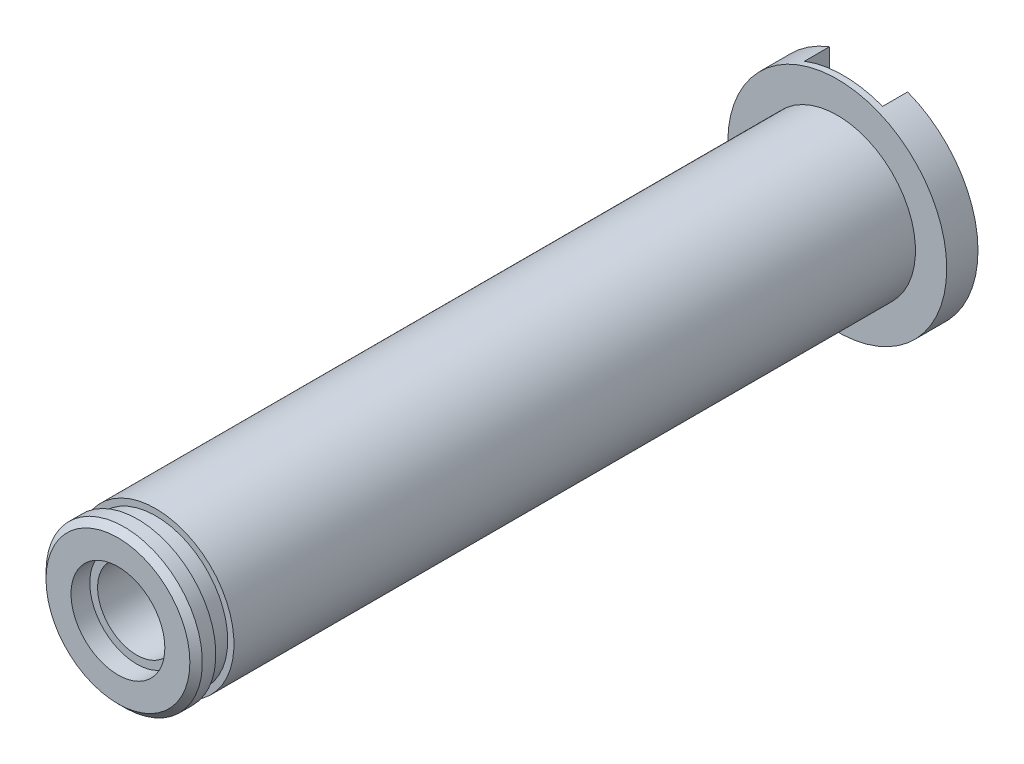
ISO-10303-21;
HEADER;
FILE_DESCRIPTION(('STEP AP214'),'2;1');
FILE_NAME('part.step','',(''),(''),'','','');
FILE_SCHEMA(('AUTOMOTIVE_DESIGN { 1 0 10303 214 1 1 1 1 }'));
ENDSEC;
DATA;
#1=APPLICATION_CONTEXT('core data for automotive mechanical design processes');
#2=APPLICATION_PROTOCOL_DEFINITION('international standard','automotive_design',2000,#1);
#3=PRODUCT_CONTEXT('',#1,'mechanical');
#4=PRODUCT('Part','Part','',(#3));
#5=PRODUCT_RELATED_PRODUCT_CATEGORY('part','',(#4));
#6=PRODUCT_DEFINITION_FORMATION('','',#4);
#7=PRODUCT_DEFINITION_CONTEXT('part definition',#1,'design');
#8=PRODUCT_DEFINITION('design','',#6,#7);
#9=PRODUCT_DEFINITION_SHAPE('','',#8);
#10=(LENGTH_UNIT() NAMED_UNIT(*) SI_UNIT(.MILLI.,.METRE.));
#11=(NAMED_UNIT(*) PLANE_ANGLE_UNIT() SI_UNIT($,.RADIAN.));
#12=(NAMED_UNIT(*) SI_UNIT($,.STERADIAN.) SOLID_ANGLE_UNIT());
#13=UNCERTAINTY_MEASURE_WITH_UNIT(LENGTH_MEASURE(1.E-05),#10,'distance_accuracy_value','');
#14=(GEOMETRIC_REPRESENTATION_CONTEXT(3) GLOBAL_UNCERTAINTY_ASSIGNED_CONTEXT((#13)) GLOBAL_UNIT_ASSIGNED_CONTEXT((#10,
#11,#12)) REPRESENTATION_CONTEXT('',''));
#15=CARTESIAN_POINT('',(0.,0.,0.));
#16=DIRECTION('',(0.,0.,1.));
#17=DIRECTION('',(1.,0.,0.));
#18=AXIS2_PLACEMENT_3D('',#15,#16,#17);
#19=CARTESIAN_POINT('',(0.,0.,30.48));
#20=DIRECTION('',(0.,0.,-1.));
#21=DIRECTION('',(-1.,0.,0.));
#22=AXIS2_PLACEMENT_3D('',#19,#20,#21);
#23=CYLINDRICAL_SURFACE('',#22,3.175);
#24=CARTESIAN_POINT('',(0.,0.,1.27));
#25=DIRECTION('',(0.,0.,1.));
#26=DIRECTION('',(1.,0.,0.));
#27=AXIS2_PLACEMENT_3D('',#24,#25,#26);
#28=CIRCLE('',#27,3.175);
#29=CARTESIAN_POINT('',(-3.175,0.,1.27));
#30=VERTEX_POINT('',#29);
#31=EDGE_CURVE('E138',#30,#30,#28,.T.);
#32=CARTESIAN_POINT('',(0.,0.,28.9433));
#33=DIRECTION('',(0.,0.,1.));
#34=DIRECTION('',(1.,0.,0.));
#35=AXIS2_PLACEMENT_3D('',#32,#33,#34);
#36=CIRCLE('',#35,3.175);
#37=CARTESIAN_POINT('',(-3.175,0.,28.9433));
#38=VERTEX_POINT('',#37);
#39=EDGE_CURVE('E202',#38,#38,#36,.T.);
#40=CARTESIAN_POINT('',(-3.175,0.,1.27));
#41=CARTESIAN_POINT('',(-3.175,0.,1.55826354166667));
#42=CARTESIAN_POINT('',(-3.175,0.,1.84652708333333));
#43=CARTESIAN_POINT('',(-3.175,0.,2.42305416666667));
#44=CARTESIAN_POINT('',(-3.175,0.,2.71131770833333));
#45=CARTESIAN_POINT('',(-3.175,0.,3.28784479166667));
#46=CARTESIAN_POINT('',(-3.175,0.,3.57610833333333));
#47=CARTESIAN_POINT('',(-3.175,0.,4.15263541666667));
#48=CARTESIAN_POINT('',(-3.175,0.,4.44089895833334));
#49=CARTESIAN_POINT('',(-3.175,0.,5.01742604166667));
#50=CARTESIAN_POINT('',(-3.175,0.,5.30568958333334));
#51=CARTESIAN_POINT('',(-3.175,0.,5.88221666666667));
#52=CARTESIAN_POINT('',(-3.175,0.,6.17048020833333));
#53=CARTESIAN_POINT('',(-3.175,0.,6.74700729166667));
#54=CARTESIAN_POINT('',(-3.175,0.,7.03527083333333));
#55=CARTESIAN_POINT('',(-3.175,0.,7.61179791666667));
#56=CARTESIAN_POINT('',(-3.175,0.,7.90006145833333));
#57=CARTESIAN_POINT('',(-3.175,0.,8.47658854166667));
#58=CARTESIAN_POINT('',(-3.175,0.,8.76485208333333));
#59=CARTESIAN_POINT('',(-3.175,0.,9.34137916666667));
#60=CARTESIAN_POINT('',(-3.175,0.,9.62964270833333));
#61=CARTESIAN_POINT('',(-3.175,0.,10.2061697916667));
#62=CARTESIAN_POINT('',(-3.175,0.,10.4944333333333));
#63=CARTESIAN_POINT('',(-3.175,0.,11.0709604166667));
#64=CARTESIAN_POINT('',(-3.175,0.,11.3592239583333));
#65=CARTESIAN_POINT('',(-3.175,0.,11.9357510416667));
#66=CARTESIAN_POINT('',(-3.175,0.,12.2240145833333));
#67=CARTESIAN_POINT('',(-3.175,0.,12.8005416666667));
#68=CARTESIAN_POINT('',(-3.175,0.,13.0888052083333));
#69=CARTESIAN_POINT('',(-3.175,0.,13.6653322916667));
#70=CARTESIAN_POINT('',(-3.175,0.,13.9535958333333));
#71=CARTESIAN_POINT('',(-3.175,0.,14.5301229166667));
#72=CARTESIAN_POINT('',(-3.175,0.,14.8183864583333));
#73=CARTESIAN_POINT('',(-3.175,0.,15.3949135416667));
#74=CARTESIAN_POINT('',(-3.175,0.,15.6831770833333));
#75=CARTESIAN_POINT('',(-3.175,0.,16.2597041666667));
#76=CARTESIAN_POINT('',(-3.175,0.,16.5479677083333));
#77=CARTESIAN_POINT('',(-3.175,0.,17.1244947916667));
#78=CARTESIAN_POINT('',(-3.175,0.,17.4127583333333));
#79=CARTESIAN_POINT('',(-3.175,0.,17.9892854166667));
#80=CARTESIAN_POINT('',(-3.175,0.,18.2775489583333));
#81=CARTESIAN_POINT('',(-3.175,0.,18.8540760416667));
#82=CARTESIAN_POINT('',(-3.175,0.,19.1423395833333));
#83=CARTESIAN_POINT('',(-3.175,0.,19.7188666666667));
#84=CARTESIAN_POINT('',(-3.175,0.,20.0071302083333));
#85=CARTESIAN_POINT('',(-3.175,0.,20.5836572916667));
#86=CARTESIAN_POINT('',(-3.175,0.,20.8719208333333));
#87=CARTESIAN_POINT('',(-3.175,0.,21.4484479166667));
#88=CARTESIAN_POINT('',(-3.175,0.,21.7367114583333));
#89=CARTESIAN_POINT('',(-3.175,0.,22.3132385416667));
#90=CARTESIAN_POINT('',(-3.175,0.,22.6015020833333));
#91=CARTESIAN_POINT('',(-3.175,0.,23.1780291666667));
#92=CARTESIAN_POINT('',(-3.175,0.,23.4662927083333));
#93=CARTESIAN_POINT('',(-3.175,0.,24.0428197916667));
#94=CARTESIAN_POINT('',(-3.175,0.,24.3310833333333));
#95=CARTESIAN_POINT('',(-3.175,0.,24.9076104166667));
#96=CARTESIAN_POINT('',(-3.175,0.,25.1958739583333));
#97=CARTESIAN_POINT('',(-3.175,0.,25.7724010416667));
#98=CARTESIAN_POINT('',(-3.175,0.,26.0606645833333));
#99=CARTESIAN_POINT('',(-3.175,0.,26.6371916666667));
#100=CARTESIAN_POINT('',(-3.175,0.,26.9254552083333));
#101=CARTESIAN_POINT('',(-3.175,0.,27.5019822916667));
#102=CARTESIAN_POINT('',(-3.175,0.,27.7902458333333));
#103=CARTESIAN_POINT('',(-3.175,0.,28.3667729166667));
#104=CARTESIAN_POINT('',(-3.175,0.,28.6550364583333));
#105=CARTESIAN_POINT('',(-3.175,0.,28.9433));
#106=B_SPLINE_CURVE_WITH_KNOTS('',3,(#40,#41,#42,#43,#44,#45,#46,#47,#48,#49,#50,#51,#52,#53,
#54,#55,#56,#57,#58,#59,#60,#61,#62,#63,#64,#65,#66,#67,#68,#69,#70,#71,#72,#73,#74,#75,#76,#77,
#78,#79,#80,#81,#82,#83,#84,#85,#86,#87,#88,#89,#90,#91,#92,#93,#94,#95,#96,#97,#98,#99,#100,
#101,#102,#103,#104,#105),.UNSPECIFIED.,.F.,.F.,(4,2,2,2,2,2,2,2,2,2,2,2,2,2,2,2,2,2,2,2,2,2,2,
2,2,2,2,2,2,2,2,2,4),(0.,0.864790625,1.72958125,2.594371875,3.4591625,4.323953125,5.18874375,
6.053534375,6.918325,7.783115625,8.64790625,9.512696875,10.3774875,11.242278125,12.10706875,
12.971859375,13.83665,14.701440625,15.56623125,16.431021875,17.2958125,18.160603125,19.02539375,
19.890184375,20.754975,21.619765625,22.48455625,23.349346875,24.2141375,25.078928125,
25.94371875,26.808509375,27.6733),.UNSPECIFIED.);
#107=EDGE_CURVE('BSEAM51',#30,#38,#106,.T.);
#108=ORIENTED_EDGE('',*,*,#31,.T.);
#109=ORIENTED_EDGE('',*,*,#39,.F.);
#110=ORIENTED_EDGE('',*,*,#107,.T.);
#111=ORIENTED_EDGE('',*,*,#107,.F.);
#112=EDGE_LOOP('',(#108,#110,#109,#111));
#113=FACE_BOUND('',#112,.T.);
#114=ADVANCED_FACE('F51',(#113),#23,.T.);
#115=CARTESIAN_POINT('',(0.,0.,-7.11199999999998));
#116=DIRECTION('',(0.,0.,1.));
#117=DIRECTION('',(1.,0.,0.));
#118=AXIS2_PLACEMENT_3D('',#115,#116,#117);
#119=CYLINDRICAL_SURFACE('',#118,1.5875);
#120=CARTESIAN_POINT('',(0.,0.,1.016));
#121=DIRECTION('',(0.,0.,-1.));
#122=DIRECTION('',(-1.,0.,0.));
#123=AXIS2_PLACEMENT_3D('',#120,#121,#122);
#124=CIRCLE('',#123,1.5875);
#125=CARTESIAN_POINT('',(1.5875,0.,1.016));
#126=VERTEX_POINT('',#125);
#127=CARTESIAN_POINT('',(-1.5875,0.,1.016));
#128=VERTEX_POINT('',#127);
#129=EDGE_CURVE('E97',#126,#128,#124,.F.);
#130=ORIENTED_EDGE('',*,*,#129,.F.);
#131=DIRECTION('',(0.,0.,-1.));
#132=VECTOR('',#131,1.);
#133=CARTESIAN_POINT('',(1.5875,0.,1.016));
#134=LINE('',#133,#132);
#135=CARTESIAN_POINT('',(1.5875,0.,0.));
#136=VERTEX_POINT('',#135);
#137=EDGE_CURVE('E105',#126,#136,#134,.T.);
#138=ORIENTED_EDGE('',*,*,#137,.T.);
#139=CARTESIAN_POINT('',(0.,0.,0.));
#140=DIRECTION('',(0.,0.,1.));
#141=DIRECTION('',(1.,0.,0.));
#142=AXIS2_PLACEMENT_3D('',#139,#140,#141);
#143=CIRCLE('',#142,1.5875);
#144=CARTESIAN_POINT('',(-1.5875,0.,0.));
#145=VERTEX_POINT('',#144);
#146=EDGE_CURVE('E134',#145,#136,#143,.T.);
#147=ORIENTED_EDGE('',*,*,#146,.F.);
#148=DIRECTION('',(0.,0.,-1.));
#149=VECTOR('',#148,1.);
#150=CARTESIAN_POINT('',(-1.5875,0.,1.016));
#151=LINE('',#150,#149);
#152=EDGE_CURVE('E68',#128,#145,#151,.T.);
#153=ORIENTED_EDGE('',*,*,#152,.F.);
#154=EDGE_LOOP('',(#130,#138,#147,#153));
#155=FACE_BOUND('',#154,.T.);
#156=CARTESIAN_POINT('',(0.,0.,29.718));
#157=DIRECTION('',(0.,0.,1.));
#158=DIRECTION('',(1.,0.,0.));
#159=AXIS2_PLACEMENT_3D('',#156,#157,#158);
#160=CIRCLE('',#159,1.5875);
#161=CARTESIAN_POINT('',(1.5875,0.,29.718));
#162=VERTEX_POINT('',#161);
#163=EDGE_CURVE('E132',#162,#162,#160,.F.);
#164=ORIENTED_EDGE('',*,*,#163,.F.);
#165=EDGE_LOOP('',(#164));
#166=FACE_BOUND('',#165,.T.);
#167=ADVANCED_FACE('F114',(#155,#166),#119,.F.);
#168=CARTESIAN_POINT('',(0.,0.,1.27));
#169=DIRECTION('',(0.,0.,-1.));
#170=DIRECTION('',(-1.,0.,0.));
#171=AXIS2_PLACEMENT_3D('',#168,#169,#170);
#172=CYLINDRICAL_SURFACE('',#171,4.445);
#173=CARTESIAN_POINT('',(0.,0.,0.));
#174=DIRECTION('',(0.,0.,1.));
#175=DIRECTION('',(1.,0.,0.));
#176=AXIS2_PLACEMENT_3D('',#173,#174,#175);
#177=CIRCLE('',#176,4.445);
#178=CARTESIAN_POINT('',(-1.5875,4.15185124372249,0.));
#179=VERTEX_POINT('',#178);
#180=CARTESIAN_POINT('',(1.5875,4.15185124372249,0.));
#181=VERTEX_POINT('',#180);
#182=EDGE_CURVE('E137',#179,#181,#177,.T.);
#183=ORIENTED_EDGE('',*,*,#182,.T.);
#184=DIRECTION('',(0.,0.,-1.));
#185=VECTOR('',#184,1.);
#186=CARTESIAN_POINT('',(1.5875,4.15185124372249,1.27));
#187=LINE('',#186,#185);
#188=CARTESIAN_POINT('',(1.5875,4.15185124372249,1.016));
#189=VERTEX_POINT('',#188);
#190=EDGE_CURVE('E118',#181,#189,#187,.F.);
#191=ORIENTED_EDGE('',*,*,#190,.T.);
#192=CARTESIAN_POINT('',(0.,0.,1.016));
#193=DIRECTION('',(0.,0.,-1.));
#194=DIRECTION('',(-1.,0.,0.));
#195=AXIS2_PLACEMENT_3D('',#192,#193,#194);
#196=CIRCLE('',#195,4.445);
#197=CARTESIAN_POINT('',(-1.5875,4.15185124372249,1.016));
#198=VERTEX_POINT('',#197);
#199=EDGE_CURVE('E76',#198,#189,#196,.T.);
#200=ORIENTED_EDGE('',*,*,#199,.F.);
#201=DIRECTION('',(0.,0.,-1.));
#202=VECTOR('',#201,1.);
#203=CARTESIAN_POINT('',(-1.5875,4.15185124372249,1.27));
#204=LINE('',#203,#202);
#205=EDGE_CURVE('E126',#198,#179,#204,.T.);
#206=ORIENTED_EDGE('',*,*,#205,.T.);
#207=EDGE_LOOP('',(#183,#191,#200,#206));
#208=FACE_BOUND('',#207,.T.);
#209=CARTESIAN_POINT('',(0.,0.,1.27));
#210=DIRECTION('',(0.,0.,1.));
#211=DIRECTION('',(1.,0.,0.));
#212=AXIS2_PLACEMENT_3D('',#209,#210,#211);
#213=CIRCLE('',#212,4.445);
#214=CARTESIAN_POINT('',(4.445,0.,1.27));
#215=VERTEX_POINT('',#214);
#216=EDGE_CURVE('E142',#215,#215,#213,.T.);
#217=ORIENTED_EDGE('',*,*,#216,.F.);
#218=EDGE_LOOP('',(#217));
#219=FACE_BOUND('',#218,.T.);
#220=ADVANCED_FACE('F180',(#208,#219),#172,.T.);
#221=CARTESIAN_POINT('',(0.,0.,1.27));
#222=DIRECTION('',(0.,0.,1.));
#223=DIRECTION('',(1.,0.,0.));
#224=AXIS2_PLACEMENT_3D('',#221,#222,#223);
#225=PLANE('',#224);
#226=ORIENTED_EDGE('',*,*,#31,.F.);
#227=EDGE_LOOP('',(#226));
#228=FACE_BOUND('',#227,.T.);
#229=ORIENTED_EDGE('',*,*,#216,.T.);
#230=EDGE_LOOP('',(#229));
#231=FACE_BOUND('',#230,.T.);
#232=ADVANCED_FACE('F193',(#228,#231),#225,.T.);
#233=CARTESIAN_POINT('',(0.,0.,0.));
#234=DIRECTION('',(0.,0.,1.));
#235=DIRECTION('',(1.,0.,0.));
#236=AXIS2_PLACEMENT_3D('',#233,#234,#235);
#237=PLANE('',#236);
#238=ORIENTED_EDGE('',*,*,#146,.T.);
#239=DIRECTION('',(0.,1.,0.));
#240=VECTOR('',#239,1.);
#241=CARTESIAN_POINT('',(1.5875,0.,0.));
#242=LINE('',#241,#240);
#243=EDGE_CURVE('E108',#136,#181,#242,.T.);
#244=ORIENTED_EDGE('',*,*,#243,.T.);
#245=ORIENTED_EDGE('',*,*,#182,.F.);
#246=DIRECTION('',(0.,1.,0.));
#247=VECTOR('',#246,1.);
#248=CARTESIAN_POINT('',(-1.5875,5.87336768810331,0.));
#249=LINE('',#248,#247);
#250=EDGE_CURVE('E102',#145,#179,#249,.T.);
#251=ORIENTED_EDGE('',*,*,#250,.F.);
#252=EDGE_LOOP('',(#238,#244,#245,#251));
#253=FACE_BOUND('',#252,.T.);
#254=ADVANCED_FACE('F186',(#253),#237,.F.);
#255=CARTESIAN_POINT('',(0.,0.,30.226));
#256=DIRECTION('',(0.,0.,1.));
#257=DIRECTION('',(1.,0.,0.));
#258=AXIS2_PLACEMENT_3D('',#255,#256,#257);
#259=CIRCLE('',#258,3.175);
#260=CARTESIAN_POINT('',(-3.175,0.,30.226));
#261=VERTEX_POINT('',#260);
#262=EDGE_CURVE('E13',#261,#261,#259,.F.);
#263=CARTESIAN_POINT('',(0.,0.,29.6799));
#264=DIRECTION('',(0.,0.,1.));
#265=DIRECTION('',(1.,0.,0.));
#266=AXIS2_PLACEMENT_3D('',#263,#264,#265);
#267=CIRCLE('',#266,3.175);
#268=CARTESIAN_POINT('',(-3.175,0.,29.6799));
#269=VERTEX_POINT('',#268);
#270=EDGE_CURVE('E199',#269,#269,#267,.T.);
#271=CARTESIAN_POINT('',(-3.175,0.,30.226));
#272=CARTESIAN_POINT('',(-3.175,0.,30.2203114583333));
#273=CARTESIAN_POINT('',(-3.175,0.,30.2146229166667));
#274=CARTESIAN_POINT('',(-3.175,0.,30.2032458333333));
#275=CARTESIAN_POINT('',(-3.175,0.,30.1975572916667));
#276=CARTESIAN_POINT('',(-3.175,0.,30.1861802083333));
#277=CARTESIAN_POINT('',(-3.175,0.,30.1804916666667));
#278=CARTESIAN_POINT('',(-3.175,0.,30.1691145833333));
#279=CARTESIAN_POINT('',(-3.175,0.,30.1634260416667));
#280=CARTESIAN_POINT('',(-3.175,0.,30.1520489583333));
#281=CARTESIAN_POINT('',(-3.175,0.,30.1463604166667));
#282=CARTESIAN_POINT('',(-3.175,0.,30.1349833333333));
#283=CARTESIAN_POINT('',(-3.175,0.,30.1292947916667));
#284=CARTESIAN_POINT('',(-3.175,0.,30.1179177083333));
#285=CARTESIAN_POINT('',(-3.175,0.,30.1122291666667));
#286=CARTESIAN_POINT('',(-3.175,0.,30.1008520833333));
#287=CARTESIAN_POINT('',(-3.175,0.,30.0951635416667));
#288=CARTESIAN_POINT('',(-3.175,0.,30.0837864583333));
#289=CARTESIAN_POINT('',(-3.175,0.,30.0780979166667));
#290=CARTESIAN_POINT('',(-3.175,0.,30.0667208333333));
#291=CARTESIAN_POINT('',(-3.175,0.,30.0610322916667));
#292=CARTESIAN_POINT('',(-3.175,0.,30.0496552083333));
#293=CARTESIAN_POINT('',(-3.175,0.,30.0439666666667));
#294=CARTESIAN_POINT('',(-3.175,0.,30.0325895833333));
#295=CARTESIAN_POINT('',(-3.175,0.,30.0269010416667));
#296=CARTESIAN_POINT('',(-3.175,0.,30.0155239583333));
#297=CARTESIAN_POINT('',(-3.175,0.,30.0098354166667));
#298=CARTESIAN_POINT('',(-3.175,0.,29.9984583333333));
#299=CARTESIAN_POINT('',(-3.175,0.,29.9927697916667));
#300=CARTESIAN_POINT('',(-3.175,0.,29.9813927083333));
#301=CARTESIAN_POINT('',(-3.175,0.,29.9757041666667));
#302=CARTESIAN_POINT('',(-3.175,0.,29.9643270833333));
#303=CARTESIAN_POINT('',(-3.175,0.,29.9586385416667));
#304=CARTESIAN_POINT('',(-3.175,0.,29.9472614583333));
#305=CARTESIAN_POINT('',(-3.175,0.,29.9415729166667));
#306=CARTESIAN_POINT('',(-3.175,0.,29.9301958333333));
#307=CARTESIAN_POINT('',(-3.175,0.,29.9245072916667));
#308=CARTESIAN_POINT('',(-3.175,0.,29.9131302083333));
#309=CARTESIAN_POINT('',(-3.175,0.,29.9074416666667));
#310=CARTESIAN_POINT('',(-3.175,0.,29.8960645833333));
#311=CARTESIAN_POINT('',(-3.175,0.,29.8903760416667));
#312=CARTESIAN_POINT('',(-3.175,0.,29.8789989583333));
#313=CARTESIAN_POINT('',(-3.175,0.,29.8733104166667));
#314=CARTESIAN_POINT('',(-3.175,0.,29.8619333333333));
#315=CARTESIAN_POINT('',(-3.175,0.,29.8562447916667));
#316=CARTESIAN_POINT('',(-3.175,0.,29.8448677083333));
#317=CARTESIAN_POINT('',(-3.175,0.,29.8391791666667));
#318=CARTESIAN_POINT('',(-3.175,0.,29.8278020833333));
#319=CARTESIAN_POINT('',(-3.175,0.,29.8221135416667));
#320=CARTESIAN_POINT('',(-3.175,0.,29.8107364583333));
#321=CARTESIAN_POINT('',(-3.175,0.,29.8050479166667));
#322=CARTESIAN_POINT('',(-3.175,0.,29.7936708333333));
#323=CARTESIAN_POINT('',(-3.175,0.,29.7879822916667));
#324=CARTESIAN_POINT('',(-3.175,0.,29.7766052083333));
#325=CARTESIAN_POINT('',(-3.175,0.,29.7709166666667));
#326=CARTESIAN_POINT('',(-3.175,0.,29.7595395833333));
#327=CARTESIAN_POINT('',(-3.175,0.,29.7538510416667));
#328=CARTESIAN_POINT('',(-3.175,0.,29.7424739583333));
#329=CARTESIAN_POINT('',(-3.175,0.,29.7367854166667));
#330=CARTESIAN_POINT('',(-3.175,0.,29.7254083333333));
#331=CARTESIAN_POINT('',(-3.175,0.,29.7197197916667));
#332=CARTESIAN_POINT('',(-3.175,0.,29.7083427083333));
#333=CARTESIAN_POINT('',(-3.175,0.,29.7026541666667));
#334=CARTESIAN_POINT('',(-3.175,0.,29.6912770833333));
#335=CARTESIAN_POINT('',(-3.175,0.,29.6855885416667));
#336=CARTESIAN_POINT('',(-3.175,0.,29.6799));
#337=B_SPLINE_CURVE_WITH_KNOTS('',3,(#271,#272,#273,#274,#275,#276,#277,#278,#279,#280,#281,
#282,#283,#284,#285,#286,#287,#288,#289,#290,#291,#292,#293,#294,#295,#296,#297,#298,#299,#300,
#301,#302,#303,#304,#305,#306,#307,#308,#309,#310,#311,#312,#313,#314,#315,#316,#317,#318,#319,
#320,#321,#322,#323,#324,#325,#326,#327,#328,#329,#330,#331,#332,#333,#334,#335,#336),
.UNSPECIFIED.,.F.,.F.,(4,2,2,2,2,2,2,2,2,2,2,2,2,2,2,2,2,2,2,2,2,2,2,2,2,2,2,2,2,2,2,2,4),(0.,
0.0170656249999998,0.0341312499999996,0.0511968749999994,0.0682624999999992,0.085328124999999,
0.102393749999999,0.119459374999999,0.136525000000002,0.153590625000002,0.170656250000002,
0.187721875000001,0.204787500000001,0.221853125000001,0.238918750000001,0.255984375000001,
0.273050000000004,0.290115625000004,0.307181250000003,0.324246875000003,0.341312500000003,
0.358378125000003,0.375443750000003,0.392509375000002,0.409575000000006,0.426640625000006,
0.443706250000005,0.460771875000005,0.477837500000005,0.494903125000005,0.511968750000005,
0.529034375000004,0.546100000000008),.UNSPECIFIED.);
#338=EDGE_CURVE('BSEAM176',#261,#269,#337,.T.);
#339=ORIENTED_EDGE('',*,*,#262,.T.);
#340=ORIENTED_EDGE('',*,*,#270,.T.);
#341=ORIENTED_EDGE('',*,*,#338,.T.);
#342=ORIENTED_EDGE('',*,*,#338,.F.);
#343=EDGE_LOOP('',(#339,#341,#340,#342));
#344=FACE_BOUND('',#343,.T.);
#345=ADVANCED_FACE('F176',(#344),#23,.T.);
#346=CARTESIAN_POINT('',(0.,0.,30.48));
#347=DIRECTION('',(0.,0.,1.));
#348=DIRECTION('',(1.,0.,0.));
#349=AXIS2_PLACEMENT_3D('',#346,#347,#348);
#350=PLANE('',#349);
#351=CARTESIAN_POINT('',(0.,0.,30.48));
#352=DIRECTION('',(0.,0.,1.));
#353=DIRECTION('',(1.,0.,0.));
#354=AXIS2_PLACEMENT_3D('',#351,#352,#353);
#355=CIRCLE('',#354,2.92100000000001);
#356=CARTESIAN_POINT('',(2.92100000000001,0.,30.48));
#357=VERTEX_POINT('',#356);
#358=EDGE_CURVE('E61',#357,#357,#355,.T.);
#359=ORIENTED_EDGE('',*,*,#358,.T.);
#360=EDGE_LOOP('',(#359));
#361=FACE_BOUND('',#360,.T.);
#362=CARTESIAN_POINT('',(0.,0.,30.48));
#363=DIRECTION('',(0.,0.,1.));
#364=DIRECTION('',(1.,0.,0.));
#365=AXIS2_PLACEMENT_3D('',#362,#363,#364);
#366=CIRCLE('',#365,1.905);
#367=CARTESIAN_POINT('',(1.905,0.,30.48));
#368=VERTEX_POINT('',#367);
#369=EDGE_CURVE('E117',#368,#368,#366,.T.);
#370=ORIENTED_EDGE('',*,*,#369,.F.);
#371=EDGE_LOOP('',(#370));
#372=FACE_BOUND('',#371,.T.);
#373=ADVANCED_FACE('F160',(#361,#372),#350,.T.);
#374=CARTESIAN_POINT('',(0.,0.,29.718));
#375=DIRECTION('',(0.,0.,1.));
#376=DIRECTION('',(1.,0.,0.));
#377=AXIS2_PLACEMENT_3D('',#374,#375,#376);
#378=PLANE('',#377);
#379=CARTESIAN_POINT('',(0.,0.,29.718));
#380=DIRECTION('',(0.,0.,1.));
#381=DIRECTION('',(1.,0.,0.));
#382=AXIS2_PLACEMENT_3D('',#379,#380,#381);
#383=CIRCLE('',#382,1.905);
#384=CARTESIAN_POINT('',(1.905,0.,29.718));
#385=VERTEX_POINT('',#384);
#386=EDGE_CURVE('E124',#385,#385,#383,.T.);
#387=ORIENTED_EDGE('',*,*,#386,.T.);
#388=EDGE_LOOP('',(#387));
#389=FACE_BOUND('',#388,.T.);
#390=ORIENTED_EDGE('',*,*,#163,.T.);
#391=EDGE_LOOP('',(#390));
#392=FACE_BOUND('',#391,.T.);
#393=ADVANCED_FACE('F192',(#389,#392),#378,.T.);
#394=CARTESIAN_POINT('',(0.,0.,29.718));
#395=DIRECTION('',(0.,0.,1.));
#396=DIRECTION('',(1.,0.,0.));
#397=AXIS2_PLACEMENT_3D('',#394,#395,#396);
#398=CYLINDRICAL_SURFACE('',#397,1.905);
#399=CARTESIAN_POINT('',(1.905,0.,29.718));
#400=CARTESIAN_POINT('',(1.905,0.,29.7259375));
#401=CARTESIAN_POINT('',(1.905,0.,29.733875));
#402=CARTESIAN_POINT('',(1.905,0.,29.74975));
#403=CARTESIAN_POINT('',(1.905,0.,29.7576875));
#404=CARTESIAN_POINT('',(1.905,0.,29.7735625));
#405=CARTESIAN_POINT('',(1.905,0.,29.7815));
#406=CARTESIAN_POINT('',(1.905,0.,29.797375));
#407=CARTESIAN_POINT('',(1.905,0.,29.8053125));
#408=CARTESIAN_POINT('',(1.905,0.,29.8211875));
#409=CARTESIAN_POINT('',(1.905,0.,29.829125));
#410=CARTESIAN_POINT('',(1.905,0.,29.845));
#411=CARTESIAN_POINT('',(1.905,0.,29.8529375));
#412=CARTESIAN_POINT('',(1.905,0.,29.8688125));
#413=CARTESIAN_POINT('',(1.905,0.,29.87675));
#414=CARTESIAN_POINT('',(1.905,0.,29.892625));
#415=CARTESIAN_POINT('',(1.905,0.,29.9005625));
#416=CARTESIAN_POINT('',(1.905,0.,29.9164375));
#417=CARTESIAN_POINT('',(1.905,0.,29.924375));
#418=CARTESIAN_POINT('',(1.905,0.,29.94025));
#419=CARTESIAN_POINT('',(1.905,0.,29.9481875));
#420=CARTESIAN_POINT('',(1.905,0.,29.9640625));
#421=CARTESIAN_POINT('',(1.905,0.,29.972));
#422=CARTESIAN_POINT('',(1.905,0.,29.987875));
#423=CARTESIAN_POINT('',(1.905,0.,29.9958125));
#424=CARTESIAN_POINT('',(1.905,0.,30.0116875));
#425=CARTESIAN_POINT('',(1.905,0.,30.019625));
#426=CARTESIAN_POINT('',(1.905,0.,30.0355));
#427=CARTESIAN_POINT('',(1.905,0.,30.0434375));
#428=CARTESIAN_POINT('',(1.905,0.,30.0593125));
#429=CARTESIAN_POINT('',(1.905,0.,30.06725));
#430=CARTESIAN_POINT('',(1.905,0.,30.083125));
#431=CARTESIAN_POINT('',(1.905,0.,30.0910625));
#432=CARTESIAN_POINT('',(1.905,0.,30.1069375));
#433=CARTESIAN_POINT('',(1.905,0.,30.114875));
#434=CARTESIAN_POINT('',(1.905,0.,30.13075));
#435=CARTESIAN_POINT('',(1.905,0.,30.1386875));
#436=CARTESIAN_POINT('',(1.905,0.,30.1545625));
#437=CARTESIAN_POINT('',(1.905,0.,30.1625));
#438=CARTESIAN_POINT('',(1.905,0.,30.178375));
#439=CARTESIAN_POINT('',(1.905,0.,30.1863125));
#440=CARTESIAN_POINT('',(1.905,0.,30.2021875));
#441=CARTESIAN_POINT('',(1.905,0.,30.210125));
#442=CARTESIAN_POINT('',(1.905,0.,30.226));
#443=CARTESIAN_POINT('',(1.905,0.,30.2339375));
#444=CARTESIAN_POINT('',(1.905,0.,30.2498125));
#445=CARTESIAN_POINT('',(1.905,0.,30.25775));
#446=CARTESIAN_POINT('',(1.905,0.,30.273625));
#447=CARTESIAN_POINT('',(1.905,0.,30.2815625));
#448=CARTESIAN_POINT('',(1.905,0.,30.2974375));
#449=CARTESIAN_POINT('',(1.905,0.,30.305375));
#450=CARTESIAN_POINT('',(1.905,0.,30.32125));
#451=CARTESIAN_POINT('',(1.905,0.,30.3291875));
#452=CARTESIAN_POINT('',(1.905,0.,30.3450625));
#453=CARTESIAN_POINT('',(1.905,0.,30.353));
#454=CARTESIAN_POINT('',(1.905,0.,30.368875));
#455=CARTESIAN_POINT('',(1.905,0.,30.3768125));
#456=CARTESIAN_POINT('',(1.905,0.,30.3926875));
#457=CARTESIAN_POINT('',(1.905,0.,30.400625));
#458=CARTESIAN_POINT('',(1.905,0.,30.4165));
#459=CARTESIAN_POINT('',(1.905,0.,30.4244375));
#460=CARTESIAN_POINT('',(1.905,0.,30.4403125));
#461=CARTESIAN_POINT('',(1.905,0.,30.44825));
#462=CARTESIAN_POINT('',(1.905,0.,30.464125));
#463=CARTESIAN_POINT('',(1.905,0.,30.4720625));
#464=CARTESIAN_POINT('',(1.905,0.,30.48));
#465=B_SPLINE_CURVE_WITH_KNOTS('',3,(#399,#400,#401,#402,#403,#404,#405,#406,#407,#408,#409,
#410,#411,#412,#413,#414,#415,#416,#417,#418,#419,#420,#421,#422,#423,#424,#425,#426,#427,#428,
#429,#430,#431,#432,#433,#434,#435,#436,#437,#438,#439,#440,#441,#442,#443,#444,#445,#446,#447,
#448,#449,#450,#451,#452,#453,#454,#455,#456,#457,#458,#459,#460,#461,#462,#463,#464),
.UNSPECIFIED.,.F.,.F.,(4,2,2,2,2,2,2,2,2,2,2,2,2,2,2,2,2,2,2,2,2,2,2,2,2,2,2,2,2,2,2,2,4),(0.,
0.0238124999999978,0.0476249999999991,0.0714374999999969,0.0952499999999981,0.119062499999999,
0.142874999999997,0.166687499999998,0.1905,0.214312499999997,0.238124999999999,
0.261937499999997,0.285749999999998,0.309562499999999,0.333374999999997,0.357187499999998,
0.380999999999999,0.404812499999997,0.428624999999998,0.452437499999996,0.476249999999998,
0.500062499999999,0.523874999999997,0.547687499999998,0.571499999999999,0.595312499999997,
0.619124999999998,0.642937499999996,0.666749999999997,0.690562499999998,0.714374999999996,
0.738187499999998,0.761999999999999),.UNSPECIFIED.);
#466=EDGE_CURVE('BSEAM242',#385,#368,#465,.T.);
#467=ORIENTED_EDGE('',*,*,#386,.F.);
#468=ORIENTED_EDGE('',*,*,#369,.T.);
#469=ORIENTED_EDGE('',*,*,#466,.T.);
#470=ORIENTED_EDGE('',*,*,#466,.F.);
#471=EDGE_LOOP('',(#467,#469,#468,#470));
#472=FACE_BOUND('',#471,.T.);
#473=ADVANCED_FACE('F242',(#472),#398,.F.);
#474=CARTESIAN_POINT('',(0.,0.,1.016));
#475=DIRECTION('',(0.,0.,-1.));
#476=DIRECTION('',(-1.,0.,0.));
#477=AXIS2_PLACEMENT_3D('',#474,#475,#476);
#478=PLANE('',#477);
#479=ORIENTED_EDGE('',*,*,#129,.T.);
#480=DIRECTION('',(0.,1.,0.));
#481=VECTOR('',#480,1.);
#482=CARTESIAN_POINT('',(-1.5875,5.87336768810331,1.016));
#483=LINE('',#482,#481);
#484=EDGE_CURVE('E101',#128,#198,#483,.T.);
#485=ORIENTED_EDGE('',*,*,#484,.T.);
#486=ORIENTED_EDGE('',*,*,#199,.T.);
#487=DIRECTION('',(0.,-1.,0.));
#488=VECTOR('',#487,1.);
#489=CARTESIAN_POINT('',(1.5875,5.87336768810331,1.016));
#490=LINE('',#489,#488);
#491=EDGE_CURVE('E93',#189,#126,#490,.T.);
#492=ORIENTED_EDGE('',*,*,#491,.T.);
#493=EDGE_LOOP('',(#479,#485,#486,#492));
#494=FACE_BOUND('',#493,.T.);
#495=ADVANCED_FACE('F95',(#494),#478,.T.);
#496=CARTESIAN_POINT('',(1.5875,5.87336768810331,1.016));
#497=DIRECTION('',(1.,0.,0.));
#498=DIRECTION('',(0.,1.,0.));
#499=AXIS2_PLACEMENT_3D('',#496,#497,#498);
#500=PLANE('',#499);
#501=ORIENTED_EDGE('',*,*,#243,.F.);
#502=ORIENTED_EDGE('',*,*,#137,.F.);
#503=ORIENTED_EDGE('',*,*,#491,.F.);
#504=ORIENTED_EDGE('',*,*,#190,.F.);
#505=EDGE_LOOP('',(#501,#502,#503,#504));
#506=FACE_BOUND('',#505,.T.);
#507=ADVANCED_FACE('F106',(#506),#500,.F.);
#508=CARTESIAN_POINT('',(-1.5875,5.87336768810331,1.016));
#509=DIRECTION('',(-1.,0.,0.));
#510=DIRECTION('',(0.,-1.,0.));
#511=AXIS2_PLACEMENT_3D('',#508,#509,#510);
#512=PLANE('',#511);
#513=ORIENTED_EDGE('',*,*,#484,.F.);
#514=ORIENTED_EDGE('',*,*,#152,.T.);
#515=ORIENTED_EDGE('',*,*,#250,.T.);
#516=ORIENTED_EDGE('',*,*,#205,.F.);
#517=EDGE_LOOP('',(#513,#514,#515,#516));
#518=FACE_BOUND('',#517,.T.);
#519=ADVANCED_FACE('F226',(#518),#512,.F.);
#520=CARTESIAN_POINT('',(0.,0.,28.9433));
#521=DIRECTION('',(0.,0.,1.));
#522=DIRECTION('',(1.,0.,0.));
#523=AXIS2_PLACEMENT_3D('',#520,#521,#522);
#524=PLANE('',#523);
#525=CARTESIAN_POINT('',(0.,0.,28.9433));
#526=DIRECTION('',(0.,0.,1.));
#527=DIRECTION('',(1.,0.,0.));
#528=AXIS2_PLACEMENT_3D('',#525,#526,#527);
#529=CIRCLE('',#528,2.921);
#530=CARTESIAN_POINT('',(2.921,0.,28.9433));
#531=VERTEX_POINT('',#530);
#532=EDGE_CURVE('E203',#531,#531,#529,.T.);
#533=ORIENTED_EDGE('',*,*,#532,.F.);
#534=EDGE_LOOP('',(#533));
#535=FACE_BOUND('',#534,.T.);
#536=ORIENTED_EDGE('',*,*,#39,.T.);
#537=EDGE_LOOP('',(#536));
#538=FACE_BOUND('',#537,.T.);
#539=ADVANCED_FACE('F228',(#535,#538),#524,.T.);
#540=CARTESIAN_POINT('',(0.,0.,29.6799));
#541=DIRECTION('',(0.,0.,1.));
#542=DIRECTION('',(1.,0.,0.));
#543=AXIS2_PLACEMENT_3D('',#540,#541,#542);
#544=PLANE('',#543);
#545=CARTESIAN_POINT('',(0.,0.,29.6799));
#546=DIRECTION('',(0.,0.,1.));
#547=DIRECTION('',(1.,0.,0.));
#548=AXIS2_PLACEMENT_3D('',#545,#546,#547);
#549=CIRCLE('',#548,2.921);
#550=CARTESIAN_POINT('',(2.921,0.,29.6799));
#551=VERTEX_POINT('',#550);
#552=EDGE_CURVE('E211',#551,#551,#549,.T.);
#553=ORIENTED_EDGE('',*,*,#552,.T.);
#554=EDGE_LOOP('',(#553));
#555=FACE_BOUND('',#554,.T.);
#556=ORIENTED_EDGE('',*,*,#270,.F.);
#557=EDGE_LOOP('',(#556));
#558=FACE_BOUND('',#557,.T.);
#559=ADVANCED_FACE('F169',(#555,#558),#544,.F.);
#560=CARTESIAN_POINT('',(0.,0.,28.9433));
#561=DIRECTION('',(0.,0.,1.));
#562=DIRECTION('',(1.,0.,0.));
#563=AXIS2_PLACEMENT_3D('',#560,#561,#562);
#564=CYLINDRICAL_SURFACE('',#563,2.921);
#565=ORIENTED_EDGE('',*,*,#532,.T.);
#566=EDGE_LOOP('',(#565));
#567=FACE_BOUND('',#566,.T.);
#568=ORIENTED_EDGE('',*,*,#552,.F.);
#569=EDGE_LOOP('',(#568));
#570=FACE_BOUND('',#569,.T.);
#571=ADVANCED_FACE('F164',(#567,#570),#564,.T.);
#572=CARTESIAN_POINT('',(0.,0.,30.48));
#573=DIRECTION('',(0.,0.,-1.));
#574=DIRECTION('',(-1.,0.,0.));
#575=AXIS2_PLACEMENT_3D('',#572,#573,#574);
#576=CONICAL_SURFACE('',#575,2.92100000000001,0.785398163397441);
#577=ORIENTED_EDGE('',*,*,#262,.F.);
#578=EDGE_LOOP('',(#577));
#579=FACE_BOUND('',#578,.T.);
#580=ORIENTED_EDGE('',*,*,#358,.F.);
#581=EDGE_LOOP('',(#580));
#582=FACE_BOUND('',#581,.T.);
#583=ADVANCED_FACE('F54',(#579,#582),#576,.T.);
#584=CLOSED_SHELL('',(#114,#167,#220,#232,#254,#345,#373,#393,#473,#495,#507,#519,#539,#559,
#571,#583));
#585=MANIFOLD_SOLID_BREP('B2',#584);
#586=ADVANCED_BREP_SHAPE_REPRESENTATION('',(#18,#585),#14);
#587=SHAPE_DEFINITION_REPRESENTATION(#9,#586);
ENDSEC;
END-ISO-10303-21;
